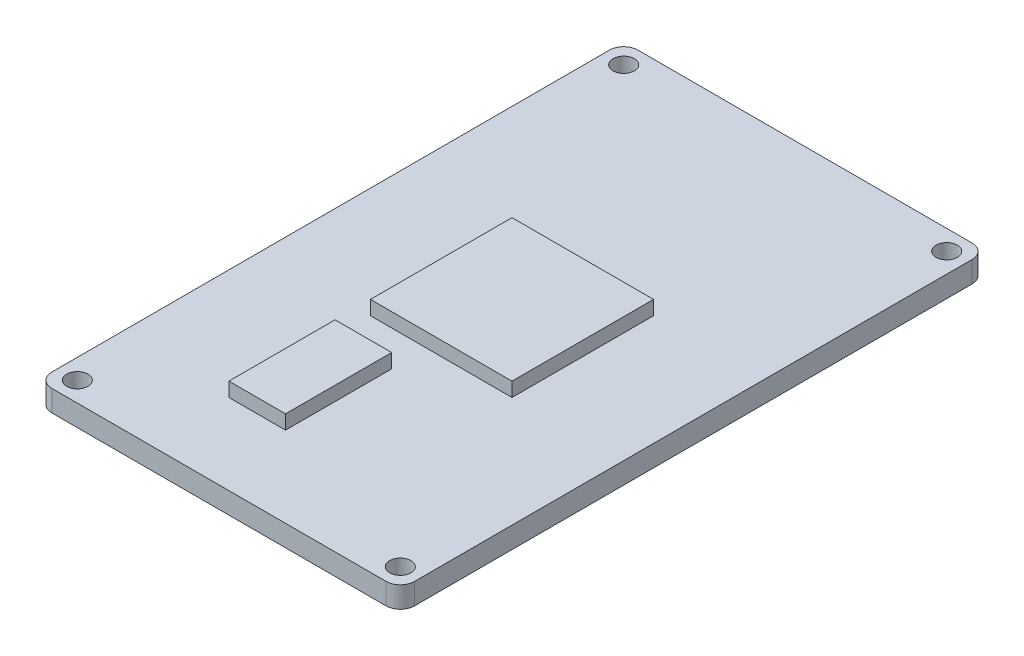
ISO-10303-21;
HEADER;
FILE_DESCRIPTION(('STEP AP214'),'2;1');
FILE_NAME('part.step','',(''),(''),'','','');
FILE_SCHEMA(('AUTOMOTIVE_DESIGN { 1 0 10303 214 1 1 1 1 }'));
ENDSEC;
DATA;
#1=APPLICATION_CONTEXT('core data for automotive mechanical design processes');
#2=APPLICATION_PROTOCOL_DEFINITION('international standard','automotive_design',2000,#1);
#3=PRODUCT_CONTEXT('',#1,'mechanical');
#4=PRODUCT('Part','Part','',(#3));
#5=PRODUCT_RELATED_PRODUCT_CATEGORY('part','',(#4));
#6=PRODUCT_DEFINITION_FORMATION('','',#4);
#7=PRODUCT_DEFINITION_CONTEXT('part definition',#1,'design');
#8=PRODUCT_DEFINITION('design','',#6,#7);
#9=PRODUCT_DEFINITION_SHAPE('','',#8);
#10=(LENGTH_UNIT() NAMED_UNIT(*) SI_UNIT(.MILLI.,.METRE.));
#11=(NAMED_UNIT(*) PLANE_ANGLE_UNIT() SI_UNIT($,.RADIAN.));
#12=(NAMED_UNIT(*) SI_UNIT($,.STERADIAN.) SOLID_ANGLE_UNIT());
#13=UNCERTAINTY_MEASURE_WITH_UNIT(LENGTH_MEASURE(1.E-05),#10,'distance_accuracy_value','');
#14=(GEOMETRIC_REPRESENTATION_CONTEXT(3) GLOBAL_UNCERTAINTY_ASSIGNED_CONTEXT((#13)) GLOBAL_UNIT_ASSIGNED_CONTEXT((#10,
#11,#12)) REPRESENTATION_CONTEXT('',''));
#15=CARTESIAN_POINT('',(0.,0.,0.));
#16=DIRECTION('',(0.,0.,1.));
#17=DIRECTION('',(1.,0.,0.));
#18=AXIS2_PLACEMENT_3D('',#15,#16,#17);
#19=CARTESIAN_POINT('',(0.,3.,0.));
#20=DIRECTION('',(0.,1.,0.));
#21=DIRECTION('',(0.,0.,1.));
#22=AXIS2_PLACEMENT_3D('',#19,#20,#21);
#23=PLANE('',#22);
#24=CARTESIAN_POINT('',(22.82,3.,38.6));
#25=DIRECTION('',(0.,-1.,0.));
#26=DIRECTION('',(0.,0.,-1.));
#27=AXIS2_PLACEMENT_3D('',#24,#25,#26);
#28=CIRCLE('',#27,1.5);
#29=CARTESIAN_POINT('',(22.82,3.,37.1));
#30=VERTEX_POINT('',#29);
#31=EDGE_CURVE('E269',#30,#30,#28,.T.);
#32=ORIENTED_EDGE('',*,*,#31,.T.);
#33=EDGE_LOOP('',(#32));
#34=FACE_BOUND('',#33,.T.);
#35=CARTESIAN_POINT('',(22.82,3.,-38.6));
#36=DIRECTION('',(0.,1.,0.));
#37=DIRECTION('',(0.,0.,1.));
#38=AXIS2_PLACEMENT_3D('',#35,#36,#37);
#39=CIRCLE('',#38,1.5);
#40=CARTESIAN_POINT('',(22.82,3.,-37.1));
#41=VERTEX_POINT('',#40);
#42=EDGE_CURVE('E287',#41,#41,#39,.T.);
#43=ORIENTED_EDGE('',*,*,#42,.F.);
#44=EDGE_LOOP('',(#43));
#45=FACE_BOUND('',#44,.T.);
#46=DIRECTION('',(1.,0.,0.));
#47=VECTOR('',#46,1.);
#48=CARTESIAN_POINT('',(-25.62,3.,-41.4));
#49=LINE('',#48,#47);
#50=CARTESIAN_POINT('',(-23.62,3.,-41.4));
#51=VERTEX_POINT('',#50);
#52=CARTESIAN_POINT('',(23.62,3.,-41.4));
#53=VERTEX_POINT('',#52);
#54=EDGE_CURVE('E298',#51,#53,#49,.T.);
#55=ORIENTED_EDGE('',*,*,#54,.F.);
#56=CARTESIAN_POINT('',(-23.62,3.,-39.4));
#57=DIRECTION('',(0.,1.,0.));
#58=DIRECTION('',(0.,0.,1.));
#59=AXIS2_PLACEMENT_3D('',#56,#57,#58);
#60=CIRCLE('',#59,2.);
#61=CARTESIAN_POINT('',(-25.62,3.,-39.4));
#62=VERTEX_POINT('',#61);
#63=EDGE_CURVE('E336',#51,#62,#60,.T.);
#64=ORIENTED_EDGE('',*,*,#63,.T.);
#65=DIRECTION('',(0.,0.,-1.));
#66=VECTOR('',#65,1.);
#67=CARTESIAN_POINT('',(-25.62,3.,41.4));
#68=LINE('',#67,#66);
#69=CARTESIAN_POINT('',(-25.62,3.,39.4));
#70=VERTEX_POINT('',#69);
#71=EDGE_CURVE('E301',#70,#62,#68,.T.);
#72=ORIENTED_EDGE('',*,*,#71,.F.);
#73=CARTESIAN_POINT('',(-23.62,3.,39.4));
#74=DIRECTION('',(0.,1.,0.));
#75=DIRECTION('',(0.,0.,1.));
#76=AXIS2_PLACEMENT_3D('',#73,#74,#75);
#77=CIRCLE('',#76,2.);
#78=CARTESIAN_POINT('',(-23.62,3.,41.4));
#79=VERTEX_POINT('',#78);
#80=EDGE_CURVE('E331',#70,#79,#77,.T.);
#81=ORIENTED_EDGE('',*,*,#80,.T.);
#82=DIRECTION('',(1.,0.,0.));
#83=VECTOR('',#82,1.);
#84=CARTESIAN_POINT('',(-25.62,3.,41.4));
#85=LINE('',#84,#83);
#86=CARTESIAN_POINT('',(23.62,3.,41.4));
#87=VERTEX_POINT('',#86);
#88=EDGE_CURVE('E293',#79,#87,#85,.T.);
#89=ORIENTED_EDGE('',*,*,#88,.T.);
#90=CARTESIAN_POINT('',(23.62,3.,39.4));
#91=DIRECTION('',(0.,1.,0.));
#92=DIRECTION('',(0.,0.,1.));
#93=AXIS2_PLACEMENT_3D('',#90,#91,#92);
#94=CIRCLE('',#93,2.);
#95=CARTESIAN_POINT('',(25.62,3.,39.4));
#96=VERTEX_POINT('',#95);
#97=EDGE_CURVE('E117',#87,#96,#94,.T.);
#98=ORIENTED_EDGE('',*,*,#97,.T.);
#99=DIRECTION('',(0.,0.,-1.));
#100=VECTOR('',#99,1.);
#101=CARTESIAN_POINT('',(25.62,3.,41.4));
#102=LINE('',#101,#100);
#103=CARTESIAN_POINT('',(25.62,3.,-39.4));
#104=VERTEX_POINT('',#103);
#105=EDGE_CURVE('E295',#96,#104,#102,.T.);
#106=ORIENTED_EDGE('',*,*,#105,.T.);
#107=CARTESIAN_POINT('',(23.62,3.,-39.4));
#108=DIRECTION('',(0.,1.,0.));
#109=DIRECTION('',(0.,0.,1.));
#110=AXIS2_PLACEMENT_3D('',#107,#108,#109);
#111=CIRCLE('',#110,2.);
#112=EDGE_CURVE('E334',#104,#53,#111,.T.);
#113=ORIENTED_EDGE('',*,*,#112,.T.);
#114=EDGE_LOOP('',(#55,#64,#72,#81,#89,#98,#106,#113));
#115=FACE_BOUND('',#114,.T.);
#116=CARTESIAN_POINT('',(-22.82,3.,-38.6));
#117=DIRECTION('',(0.,-1.,0.));
#118=DIRECTION('',(0.,0.,-1.));
#119=AXIS2_PLACEMENT_3D('',#116,#117,#118);
#120=CIRCLE('',#119,1.5);
#121=CARTESIAN_POINT('',(-22.82,3.,-40.1));
#122=VERTEX_POINT('',#121);
#123=EDGE_CURVE('E281',#122,#122,#120,.T.);
#124=ORIENTED_EDGE('',*,*,#123,.T.);
#125=EDGE_LOOP('',(#124));
#126=FACE_BOUND('',#125,.T.);
#127=CARTESIAN_POINT('',(-22.82,3.,38.6));
#128=DIRECTION('',(0.,1.,0.));
#129=DIRECTION('',(0.,0.,1.));
#130=AXIS2_PLACEMENT_3D('',#127,#128,#129);
#131=CIRCLE('',#130,1.5);
#132=CARTESIAN_POINT('',(-22.82,3.,40.1));
#133=VERTEX_POINT('',#132);
#134=EDGE_CURVE('E275',#133,#133,#131,.T.);
#135=ORIENTED_EDGE('',*,*,#134,.F.);
#136=EDGE_LOOP('',(#135));
#137=FACE_BOUND('',#136,.T.);
#138=DIRECTION('',(-1.,0.,0.));
#139=VECTOR('',#138,1.);
#140=CARTESIAN_POINT('',(-10.,3.,-10.));
#141=LINE('',#140,#139);
#142=CARTESIAN_POINT('',(10.,3.,-10.));
#143=VERTEX_POINT('',#142);
#144=CARTESIAN_POINT('',(-10.,3.,-10.));
#145=VERTEX_POINT('',#144);
#146=EDGE_CURVE('E237',#143,#145,#141,.T.);
#147=ORIENTED_EDGE('',*,*,#146,.F.);
#148=DIRECTION('',(0.,0.,-1.));
#149=VECTOR('',#148,1.);
#150=CARTESIAN_POINT('',(10.,3.,-10.));
#151=LINE('',#150,#149);
#152=CARTESIAN_POINT('',(10.,3.,10.));
#153=VERTEX_POINT('',#152);
#154=EDGE_CURVE('E234',#153,#143,#151,.T.);
#155=ORIENTED_EDGE('',*,*,#154,.F.);
#156=DIRECTION('',(1.,0.,0.));
#157=VECTOR('',#156,1.);
#158=CARTESIAN_POINT('',(-10.,3.,10.));
#159=LINE('',#158,#157);
#160=CARTESIAN_POINT('',(-10.,3.,10.));
#161=VERTEX_POINT('',#160);
#162=EDGE_CURVE('E247',#161,#153,#159,.T.);
#163=ORIENTED_EDGE('',*,*,#162,.F.);
#164=DIRECTION('',(0.,0.,1.));
#165=VECTOR('',#164,1.);
#166=CARTESIAN_POINT('',(-10.,3.,-10.));
#167=LINE('',#166,#165);
#168=EDGE_CURVE('E255',#145,#161,#167,.T.);
#169=ORIENTED_EDGE('',*,*,#168,.F.);
#170=EDGE_LOOP('',(#147,#155,#163,#169));
#171=FACE_BOUND('',#170,.T.);
#172=DIRECTION('',(1.,0.,0.));
#173=VECTOR('',#172,1.);
#174=CARTESIAN_POINT('',(-2.,3.,30.));
#175=LINE('',#174,#173);
#176=CARTESIAN_POINT('',(-10.,3.,30.));
#177=VERTEX_POINT('',#176);
#178=CARTESIAN_POINT('',(-2.,3.,30.));
#179=VERTEX_POINT('',#178);
#180=EDGE_CURVE('E610',#177,#179,#175,.T.);
#181=ORIENTED_EDGE('',*,*,#180,.F.);
#182=DIRECTION('',(0.,0.,1.));
#183=VECTOR('',#182,1.);
#184=CARTESIAN_POINT('',(-10.,3.,15.));
#185=LINE('',#184,#183);
#186=CARTESIAN_POINT('',(-10.,3.,15.));
#187=VERTEX_POINT('',#186);
#188=EDGE_CURVE('E232',#187,#177,#185,.T.);
#189=ORIENTED_EDGE('',*,*,#188,.F.);
#190=DIRECTION('',(-1.,0.,0.));
#191=VECTOR('',#190,1.);
#192=CARTESIAN_POINT('',(-2.,3.,15.));
#193=LINE('',#192,#191);
#194=CARTESIAN_POINT('',(-2.,3.,15.));
#195=VERTEX_POINT('',#194);
#196=EDGE_CURVE('E228',#195,#187,#193,.T.);
#197=ORIENTED_EDGE('',*,*,#196,.F.);
#198=DIRECTION('',(0.,0.,-1.));
#199=VECTOR('',#198,1.);
#200=CARTESIAN_POINT('',(-2.,3.,15.));
#201=LINE('',#200,#199);
#202=EDGE_CURVE('E613',#179,#195,#201,.T.);
#203=ORIENTED_EDGE('',*,*,#202,.F.);
#204=EDGE_LOOP('',(#181,#189,#197,#203));
#205=FACE_BOUND('',#204,.T.);
#206=ADVANCED_FACE('F95',(#34,#45,#115,#126,#137,#171,#205),#23,.T.);
#207=CARTESIAN_POINT('',(0.,0.,0.));
#208=DIRECTION('',(0.,1.,0.));
#209=DIRECTION('',(0.,0.,1.));
#210=AXIS2_PLACEMENT_3D('',#207,#208,#209);
#211=PLANE('',#210);
#212=CARTESIAN_POINT('',(22.82,0.,38.6));
#213=DIRECTION('',(0.,-1.,0.));
#214=DIRECTION('',(0.,0.,-1.));
#215=AXIS2_PLACEMENT_3D('',#212,#213,#214);
#216=CIRCLE('',#215,1.5);
#217=CARTESIAN_POINT('',(22.82,0.,37.1));
#218=VERTEX_POINT('',#217);
#219=EDGE_CURVE('E268',#218,#218,#216,.T.);
#220=ORIENTED_EDGE('',*,*,#219,.F.);
#221=EDGE_LOOP('',(#220));
#222=FACE_BOUND('',#221,.T.);
#223=CARTESIAN_POINT('',(-22.82,0.,-38.6));
#224=DIRECTION('',(0.,-1.,0.));
#225=DIRECTION('',(0.,0.,-1.));
#226=AXIS2_PLACEMENT_3D('',#223,#224,#225);
#227=CIRCLE('',#226,1.5);
#228=CARTESIAN_POINT('',(-22.82,0.,-40.1));
#229=VERTEX_POINT('',#228);
#230=EDGE_CURVE('E278',#229,#229,#227,.T.);
#231=ORIENTED_EDGE('',*,*,#230,.F.);
#232=EDGE_LOOP('',(#231));
#233=FACE_BOUND('',#232,.T.);
#234=DIRECTION('',(0.,0.,-1.));
#235=VECTOR('',#234,1.);
#236=CARTESIAN_POINT('',(-25.62,0.,41.4));
#237=LINE('',#236,#235);
#238=CARTESIAN_POINT('',(-25.62,0.,39.4));
#239=VERTEX_POINT('',#238);
#240=CARTESIAN_POINT('',(-25.62,0.,-39.4));
#241=VERTEX_POINT('',#240);
#242=EDGE_CURVE('E296',#239,#241,#237,.T.);
#243=ORIENTED_EDGE('',*,*,#242,.T.);
#244=CARTESIAN_POINT('',(-23.62,0.,-39.4));
#245=DIRECTION('',(0.,1.,0.));
#246=DIRECTION('',(0.,0.,1.));
#247=AXIS2_PLACEMENT_3D('',#244,#245,#246);
#248=CIRCLE('',#247,2.);
#249=CARTESIAN_POINT('',(-23.62,0.,-41.4));
#250=VERTEX_POINT('',#249);
#251=EDGE_CURVE('E324',#241,#250,#248,.F.);
#252=ORIENTED_EDGE('',*,*,#251,.T.);
#253=DIRECTION('',(1.,0.,0.));
#254=VECTOR('',#253,1.);
#255=CARTESIAN_POINT('',(-25.62,0.,-41.4));
#256=LINE('',#255,#254);
#257=CARTESIAN_POINT('',(23.62,0.,-41.4));
#258=VERTEX_POINT('',#257);
#259=EDGE_CURVE('E309',#250,#258,#256,.T.);
#260=ORIENTED_EDGE('',*,*,#259,.T.);
#261=CARTESIAN_POINT('',(23.62,0.,-39.4));
#262=DIRECTION('',(0.,1.,0.));
#263=DIRECTION('',(0.,0.,1.));
#264=AXIS2_PLACEMENT_3D('',#261,#262,#263);
#265=CIRCLE('',#264,2.);
#266=CARTESIAN_POINT('',(25.62,0.,-39.4));
#267=VERTEX_POINT('',#266);
#268=EDGE_CURVE('E322',#258,#267,#265,.F.);
#269=ORIENTED_EDGE('',*,*,#268,.T.);
#270=DIRECTION('',(0.,0.,-1.));
#271=VECTOR('',#270,1.);
#272=CARTESIAN_POINT('',(25.62,0.,41.4));
#273=LINE('',#272,#271);
#274=CARTESIAN_POINT('',(25.62,0.,39.4));
#275=VERTEX_POINT('',#274);
#276=EDGE_CURVE('E307',#275,#267,#273,.T.);
#277=ORIENTED_EDGE('',*,*,#276,.F.);
#278=CARTESIAN_POINT('',(23.62,0.,39.4));
#279=DIRECTION('',(0.,1.,0.));
#280=DIRECTION('',(0.,0.,1.));
#281=AXIS2_PLACEMENT_3D('',#278,#279,#280);
#282=CIRCLE('',#281,2.);
#283=CARTESIAN_POINT('',(23.62,0.,41.4));
#284=VERTEX_POINT('',#283);
#285=EDGE_CURVE('E320',#275,#284,#282,.F.);
#286=ORIENTED_EDGE('',*,*,#285,.T.);
#287=DIRECTION('',(1.,0.,0.));
#288=VECTOR('',#287,1.);
#289=CARTESIAN_POINT('',(-25.62,0.,41.4));
#290=LINE('',#289,#288);
#291=CARTESIAN_POINT('',(-23.62,0.,41.4));
#292=VERTEX_POINT('',#291);
#293=EDGE_CURVE('E290',#292,#284,#290,.T.);
#294=ORIENTED_EDGE('',*,*,#293,.F.);
#295=CARTESIAN_POINT('',(-23.62,0.,39.4));
#296=DIRECTION('',(0.,1.,0.));
#297=DIRECTION('',(0.,0.,1.));
#298=AXIS2_PLACEMENT_3D('',#295,#296,#297);
#299=CIRCLE('',#298,2.);
#300=EDGE_CURVE('E318',#292,#239,#299,.F.);
#301=ORIENTED_EDGE('',*,*,#300,.T.);
#302=EDGE_LOOP('',(#243,#252,#260,#269,#277,#286,#294,#301));
#303=FACE_BOUND('',#302,.T.);
#304=CARTESIAN_POINT('',(22.82,0.,-38.6));
#305=DIRECTION('',(0.,1.,0.));
#306=DIRECTION('',(0.,0.,1.));
#307=AXIS2_PLACEMENT_3D('',#304,#305,#306);
#308=CIRCLE('',#307,1.5);
#309=CARTESIAN_POINT('',(22.82,0.,-37.1));
#310=VERTEX_POINT('',#309);
#311=EDGE_CURVE('E284',#310,#310,#308,.T.);
#312=ORIENTED_EDGE('',*,*,#311,.T.);
#313=EDGE_LOOP('',(#312));
#314=FACE_BOUND('',#313,.T.);
#315=CARTESIAN_POINT('',(-22.82,0.,38.6));
#316=DIRECTION('',(0.,1.,0.));
#317=DIRECTION('',(0.,0.,1.));
#318=AXIS2_PLACEMENT_3D('',#315,#316,#317);
#319=CIRCLE('',#318,1.5);
#320=CARTESIAN_POINT('',(-22.82,0.,40.1));
#321=VERTEX_POINT('',#320);
#322=EDGE_CURVE('E272',#321,#321,#319,.T.);
#323=ORIENTED_EDGE('',*,*,#322,.T.);
#324=EDGE_LOOP('',(#323));
#325=FACE_BOUND('',#324,.T.);
#326=ADVANCED_FACE('F351',(#222,#233,#303,#314,#325),#211,.F.);
#327=CARTESIAN_POINT('',(-25.62,3.,41.4));
#328=DIRECTION('',(0.,0.,-1.));
#329=DIRECTION('',(-1.,0.,0.));
#330=AXIS2_PLACEMENT_3D('',#327,#328,#329);
#331=PLANE('',#330);
#332=ORIENTED_EDGE('',*,*,#293,.T.);
#333=DIRECTION('',(0.,-1.,0.));
#334=VECTOR('',#333,1.);
#335=CARTESIAN_POINT('',(23.62,3.,41.4));
#336=LINE('',#335,#334);
#337=EDGE_CURVE('E12',#284,#87,#336,.F.);
#338=ORIENTED_EDGE('',*,*,#337,.T.);
#339=ORIENTED_EDGE('',*,*,#88,.F.);
#340=DIRECTION('',(0.,-1.,0.));
#341=VECTOR('',#340,1.);
#342=CARTESIAN_POINT('',(-23.62,0.,41.4));
#343=LINE('',#342,#341);
#344=EDGE_CURVE('E103',#79,#292,#343,.T.);
#345=ORIENTED_EDGE('',*,*,#344,.T.);
#346=EDGE_LOOP('',(#332,#338,#339,#345));
#347=FACE_BOUND('',#346,.T.);
#348=ADVANCED_FACE('F346',(#347),#331,.F.);
#349=CARTESIAN_POINT('',(25.62,3.,41.4));
#350=DIRECTION('',(-1.,0.,0.));
#351=DIRECTION('',(0.,0.,1.));
#352=AXIS2_PLACEMENT_3D('',#349,#350,#351);
#353=PLANE('',#352);
#354=ORIENTED_EDGE('',*,*,#276,.T.);
#355=DIRECTION('',(0.,-1.,0.));
#356=VECTOR('',#355,1.);
#357=CARTESIAN_POINT('',(25.62,3.,-39.4));
#358=LINE('',#357,#356);
#359=EDGE_CURVE('E110',#267,#104,#358,.F.);
#360=ORIENTED_EDGE('',*,*,#359,.T.);
#361=ORIENTED_EDGE('',*,*,#105,.F.);
#362=DIRECTION('',(0.,-1.,0.));
#363=VECTOR('',#362,1.);
#364=CARTESIAN_POINT('',(25.62,3.,39.4));
#365=LINE('',#364,#363);
#366=EDGE_CURVE('E338',#96,#275,#365,.T.);
#367=ORIENTED_EDGE('',*,*,#366,.T.);
#368=EDGE_LOOP('',(#354,#360,#361,#367));
#369=FACE_BOUND('',#368,.T.);
#370=ADVANCED_FACE('F358',(#369),#353,.F.);
#371=CARTESIAN_POINT('',(-25.62,3.,-41.4));
#372=DIRECTION('',(0.,0.,-1.));
#373=DIRECTION('',(-1.,0.,0.));
#374=AXIS2_PLACEMENT_3D('',#371,#372,#373);
#375=PLANE('',#374);
#376=ORIENTED_EDGE('',*,*,#259,.F.);
#377=DIRECTION('',(0.,-1.,0.));
#378=VECTOR('',#377,1.);
#379=CARTESIAN_POINT('',(-23.62,3.,-41.4));
#380=LINE('',#379,#378);
#381=EDGE_CURVE('E329',#250,#51,#380,.F.);
#382=ORIENTED_EDGE('',*,*,#381,.T.);
#383=ORIENTED_EDGE('',*,*,#54,.T.);
#384=DIRECTION('',(0.,-1.,0.));
#385=VECTOR('',#384,1.);
#386=CARTESIAN_POINT('',(23.62,0.,-41.4));
#387=LINE('',#386,#385);
#388=EDGE_CURVE('E326',#53,#258,#387,.T.);
#389=ORIENTED_EDGE('',*,*,#388,.T.);
#390=EDGE_LOOP('',(#376,#382,#383,#389));
#391=FACE_BOUND('',#390,.T.);
#392=ADVANCED_FACE('F367',(#391),#375,.T.);
#393=CARTESIAN_POINT('',(-25.62,3.,41.4));
#394=DIRECTION('',(-1.,0.,0.));
#395=DIRECTION('',(0.,0.,1.));
#396=AXIS2_PLACEMENT_3D('',#393,#394,#395);
#397=PLANE('',#396);
#398=ORIENTED_EDGE('',*,*,#71,.T.);
#399=DIRECTION('',(0.,-1.,0.));
#400=VECTOR('',#399,1.);
#401=CARTESIAN_POINT('',(-25.62,3.,-39.4));
#402=LINE('',#401,#400);
#403=EDGE_CURVE('E315',#62,#241,#402,.T.);
#404=ORIENTED_EDGE('',*,*,#403,.T.);
#405=ORIENTED_EDGE('',*,*,#242,.F.);
#406=DIRECTION('',(0.,-1.,0.));
#407=VECTOR('',#406,1.);
#408=CARTESIAN_POINT('',(-25.62,3.,39.4));
#409=LINE('',#408,#407);
#410=EDGE_CURVE('E304',#239,#70,#409,.F.);
#411=ORIENTED_EDGE('',*,*,#410,.T.);
#412=EDGE_LOOP('',(#398,#404,#405,#411));
#413=FACE_BOUND('',#412,.T.);
#414=ADVANCED_FACE('F374',(#413),#397,.T.);
#415=CARTESIAN_POINT('',(22.82,3.,-38.6));
#416=DIRECTION('',(0.,-1.,0.));
#417=DIRECTION('',(0.,0.,-1.));
#418=AXIS2_PLACEMENT_3D('',#415,#416,#417);
#419=CYLINDRICAL_SURFACE('',#418,1.5);
#420=ORIENTED_EDGE('',*,*,#42,.T.);
#421=EDGE_LOOP('',(#420));
#422=FACE_BOUND('',#421,.T.);
#423=ORIENTED_EDGE('',*,*,#311,.F.);
#424=EDGE_LOOP('',(#423));
#425=FACE_BOUND('',#424,.T.);
#426=ADVANCED_FACE('F391',(#422,#425),#419,.F.);
#427=CARTESIAN_POINT('',(-22.82,3.,-38.6));
#428=DIRECTION('',(0.,-1.,0.));
#429=DIRECTION('',(0.,0.,-1.));
#430=AXIS2_PLACEMENT_3D('',#427,#428,#429);
#431=CYLINDRICAL_SURFACE('',#430,1.5);
#432=ORIENTED_EDGE('',*,*,#123,.F.);
#433=EDGE_LOOP('',(#432));
#434=FACE_BOUND('',#433,.T.);
#435=ORIENTED_EDGE('',*,*,#230,.T.);
#436=EDGE_LOOP('',(#435));
#437=FACE_BOUND('',#436,.T.);
#438=ADVANCED_FACE('F533',(#434,#437),#431,.F.);
#439=CARTESIAN_POINT('',(-22.82,3.,38.6));
#440=DIRECTION('',(0.,-1.,0.));
#441=DIRECTION('',(0.,0.,-1.));
#442=AXIS2_PLACEMENT_3D('',#439,#440,#441);
#443=CYLINDRICAL_SURFACE('',#442,1.5);
#444=ORIENTED_EDGE('',*,*,#134,.T.);
#445=EDGE_LOOP('',(#444));
#446=FACE_BOUND('',#445,.T.);
#447=ORIENTED_EDGE('',*,*,#322,.F.);
#448=EDGE_LOOP('',(#447));
#449=FACE_BOUND('',#448,.T.);
#450=ADVANCED_FACE('F524',(#446,#449),#443,.F.);
#451=CARTESIAN_POINT('',(22.82,3.,38.6));
#452=DIRECTION('',(0.,-1.,0.));
#453=DIRECTION('',(0.,0.,-1.));
#454=AXIS2_PLACEMENT_3D('',#451,#452,#453);
#455=CYLINDRICAL_SURFACE('',#454,1.5);
#456=ORIENTED_EDGE('',*,*,#31,.F.);
#457=EDGE_LOOP('',(#456));
#458=FACE_BOUND('',#457,.T.);
#459=ORIENTED_EDGE('',*,*,#219,.T.);
#460=EDGE_LOOP('',(#459));
#461=FACE_BOUND('',#460,.T.);
#462=ADVANCED_FACE('F510',(#458,#461),#455,.F.);
#463=CARTESIAN_POINT('',(10.,5.,-10.));
#464=DIRECTION('',(-1.,0.,0.));
#465=DIRECTION('',(0.,0.,1.));
#466=AXIS2_PLACEMENT_3D('',#463,#464,#465);
#467=PLANE('',#466);
#468=ORIENTED_EDGE('',*,*,#154,.T.);
#469=DIRECTION('',(0.,-1.,0.));
#470=VECTOR('',#469,1.);
#471=CARTESIAN_POINT('',(10.,5.,-10.));
#472=LINE('',#471,#470);
#473=CARTESIAN_POINT('',(10.,5.,-10.));
#474=VERTEX_POINT('',#473);
#475=EDGE_CURVE('E266',#474,#143,#472,.T.);
#476=ORIENTED_EDGE('',*,*,#475,.F.);
#477=DIRECTION('',(0.,0.,-1.));
#478=VECTOR('',#477,1.);
#479=CARTESIAN_POINT('',(10.,5.,-10.));
#480=LINE('',#479,#478);
#481=CARTESIAN_POINT('',(10.,5.,10.));
#482=VERTEX_POINT('',#481);
#483=EDGE_CURVE('E243',#482,#474,#480,.T.);
#484=ORIENTED_EDGE('',*,*,#483,.F.);
#485=DIRECTION('',(0.,-1.,0.));
#486=VECTOR('',#485,1.);
#487=CARTESIAN_POINT('',(10.,5.,10.));
#488=LINE('',#487,#486);
#489=EDGE_CURVE('E252',#482,#153,#488,.T.);
#490=ORIENTED_EDGE('',*,*,#489,.T.);
#491=EDGE_LOOP('',(#468,#476,#484,#490));
#492=FACE_BOUND('',#491,.T.);
#493=ADVANCED_FACE('F501',(#492),#467,.F.);
#494=CARTESIAN_POINT('',(-10.,5.,-10.));
#495=DIRECTION('',(0.,0.,1.));
#496=DIRECTION('',(1.,0.,0.));
#497=AXIS2_PLACEMENT_3D('',#494,#495,#496);
#498=PLANE('',#497);
#499=ORIENTED_EDGE('',*,*,#146,.T.);
#500=DIRECTION('',(0.,-1.,0.));
#501=VECTOR('',#500,1.);
#502=CARTESIAN_POINT('',(-10.,5.,-10.));
#503=LINE('',#502,#501);
#504=CARTESIAN_POINT('',(-10.,5.,-10.));
#505=VERTEX_POINT('',#504);
#506=EDGE_CURVE('E263',#505,#145,#503,.T.);
#507=ORIENTED_EDGE('',*,*,#506,.F.);
#508=DIRECTION('',(-1.,0.,0.));
#509=VECTOR('',#508,1.);
#510=CARTESIAN_POINT('',(-10.,5.,-10.));
#511=LINE('',#510,#509);
#512=EDGE_CURVE('E246',#474,#505,#511,.T.);
#513=ORIENTED_EDGE('',*,*,#512,.F.);
#514=ORIENTED_EDGE('',*,*,#475,.T.);
#515=EDGE_LOOP('',(#499,#507,#513,#514));
#516=FACE_BOUND('',#515,.T.);
#517=ADVANCED_FACE('F492',(#516),#498,.F.);
#518=CARTESIAN_POINT('',(-10.,5.,-10.));
#519=DIRECTION('',(1.,0.,0.));
#520=DIRECTION('',(0.,0.,-1.));
#521=AXIS2_PLACEMENT_3D('',#518,#519,#520);
#522=PLANE('',#521);
#523=ORIENTED_EDGE('',*,*,#168,.T.);
#524=DIRECTION('',(0.,-1.,0.));
#525=VECTOR('',#524,1.);
#526=CARTESIAN_POINT('',(-10.,5.,10.));
#527=LINE('',#526,#525);
#528=CARTESIAN_POINT('',(-10.,5.,10.));
#529=VERTEX_POINT('',#528);
#530=EDGE_CURVE('E261',#529,#161,#527,.T.);
#531=ORIENTED_EDGE('',*,*,#530,.F.);
#532=DIRECTION('',(0.,0.,1.));
#533=VECTOR('',#532,1.);
#534=CARTESIAN_POINT('',(-10.,5.,-10.));
#535=LINE('',#534,#533);
#536=EDGE_CURVE('E249',#505,#529,#535,.T.);
#537=ORIENTED_EDGE('',*,*,#536,.F.);
#538=ORIENTED_EDGE('',*,*,#506,.T.);
#539=EDGE_LOOP('',(#523,#531,#537,#538));
#540=FACE_BOUND('',#539,.T.);
#541=ADVANCED_FACE('F483',(#540),#522,.F.);
#542=CARTESIAN_POINT('',(-10.,5.,10.));
#543=DIRECTION('',(0.,0.,-1.));
#544=DIRECTION('',(-1.,0.,0.));
#545=AXIS2_PLACEMENT_3D('',#542,#543,#544);
#546=PLANE('',#545);
#547=ORIENTED_EDGE('',*,*,#162,.T.);
#548=ORIENTED_EDGE('',*,*,#489,.F.);
#549=DIRECTION('',(1.,0.,0.));
#550=VECTOR('',#549,1.);
#551=CARTESIAN_POINT('',(-10.,5.,10.));
#552=LINE('',#551,#550);
#553=EDGE_CURVE('E251',#529,#482,#552,.T.);
#554=ORIENTED_EDGE('',*,*,#553,.F.);
#555=ORIENTED_EDGE('',*,*,#530,.T.);
#556=EDGE_LOOP('',(#547,#548,#554,#555));
#557=FACE_BOUND('',#556,.T.);
#558=ADVANCED_FACE('F474',(#557),#546,.F.);
#559=CARTESIAN_POINT('',(0.,5.,0.));
#560=DIRECTION('',(0.,1.,0.));
#561=DIRECTION('',(0.,0.,1.));
#562=AXIS2_PLACEMENT_3D('',#559,#560,#561);
#563=PLANE('',#562);
#564=ORIENTED_EDGE('',*,*,#483,.T.);
#565=ORIENTED_EDGE('',*,*,#512,.T.);
#566=ORIENTED_EDGE('',*,*,#536,.T.);
#567=ORIENTED_EDGE('',*,*,#553,.T.);
#568=EDGE_LOOP('',(#564,#565,#566,#567));
#569=FACE_BOUND('',#568,.T.);
#570=ADVANCED_FACE('F466',(#569),#563,.T.);
#571=CARTESIAN_POINT('',(-10.,5.,15.));
#572=DIRECTION('',(1.,0.,0.));
#573=DIRECTION('',(0.,0.,-1.));
#574=AXIS2_PLACEMENT_3D('',#571,#572,#573);
#575=PLANE('',#574);
#576=ORIENTED_EDGE('',*,*,#188,.T.);
#577=DIRECTION('',(0.,-1.,0.));
#578=VECTOR('',#577,1.);
#579=CARTESIAN_POINT('',(-10.,5.,30.));
#580=LINE('',#579,#578);
#581=CARTESIAN_POINT('',(-10.,5.,30.));
#582=VERTEX_POINT('',#581);
#583=EDGE_CURVE('E212',#582,#177,#580,.T.);
#584=ORIENTED_EDGE('',*,*,#583,.F.);
#585=DIRECTION('',(0.,0.,1.));
#586=VECTOR('',#585,1.);
#587=CARTESIAN_POINT('',(-10.,5.,15.));
#588=LINE('',#587,#586);
#589=CARTESIAN_POINT('',(-10.,5.,15.));
#590=VERTEX_POINT('',#589);
#591=EDGE_CURVE('E219',#590,#582,#588,.T.);
#592=ORIENTED_EDGE('',*,*,#591,.F.);
#593=DIRECTION('',(0.,-1.,0.));
#594=VECTOR('',#593,1.);
#595=CARTESIAN_POINT('',(-10.,5.,15.));
#596=LINE('',#595,#594);
#597=EDGE_CURVE('E620',#590,#187,#596,.T.);
#598=ORIENTED_EDGE('',*,*,#597,.T.);
#599=EDGE_LOOP('',(#576,#584,#592,#598));
#600=FACE_BOUND('',#599,.T.);
#601=ADVANCED_FACE('F230',(#600),#575,.F.);
#602=CARTESIAN_POINT('',(-2.,5.,30.));
#603=DIRECTION('',(0.,0.,-1.));
#604=DIRECTION('',(-1.,0.,0.));
#605=AXIS2_PLACEMENT_3D('',#602,#603,#604);
#606=PLANE('',#605);
#607=ORIENTED_EDGE('',*,*,#180,.T.);
#608=DIRECTION('',(0.,-1.,0.));
#609=VECTOR('',#608,1.);
#610=CARTESIAN_POINT('',(-2.,5.,30.));
#611=LINE('',#610,#609);
#612=CARTESIAN_POINT('',(-2.,5.,30.));
#613=VERTEX_POINT('',#612);
#614=EDGE_CURVE('E215',#613,#179,#611,.T.);
#615=ORIENTED_EDGE('',*,*,#614,.F.);
#616=DIRECTION('',(1.,0.,0.));
#617=VECTOR('',#616,1.);
#618=CARTESIAN_POINT('',(-2.,5.,30.));
#619=LINE('',#618,#617);
#620=EDGE_CURVE('E208',#582,#613,#619,.T.);
#621=ORIENTED_EDGE('',*,*,#620,.F.);
#622=ORIENTED_EDGE('',*,*,#583,.T.);
#623=EDGE_LOOP('',(#607,#615,#621,#622));
#624=FACE_BOUND('',#623,.T.);
#625=ADVANCED_FACE('F210',(#624),#606,.F.);
#626=CARTESIAN_POINT('',(-2.,5.,15.));
#627=DIRECTION('',(-1.,0.,0.));
#628=DIRECTION('',(0.,0.,1.));
#629=AXIS2_PLACEMENT_3D('',#626,#627,#628);
#630=PLANE('',#629);
#631=ORIENTED_EDGE('',*,*,#202,.T.);
#632=DIRECTION('',(0.,-1.,0.));
#633=VECTOR('',#632,1.);
#634=CARTESIAN_POINT('',(-2.,5.,15.));
#635=LINE('',#634,#633);
#636=CARTESIAN_POINT('',(-2.,5.,15.));
#637=VERTEX_POINT('',#636);
#638=EDGE_CURVE('E239',#637,#195,#635,.T.);
#639=ORIENTED_EDGE('',*,*,#638,.F.);
#640=DIRECTION('',(0.,0.,-1.));
#641=VECTOR('',#640,1.);
#642=CARTESIAN_POINT('',(-2.,5.,15.));
#643=LINE('',#642,#641);
#644=EDGE_CURVE('E218',#613,#637,#643,.T.);
#645=ORIENTED_EDGE('',*,*,#644,.F.);
#646=ORIENTED_EDGE('',*,*,#614,.T.);
#647=EDGE_LOOP('',(#631,#639,#645,#646));
#648=FACE_BOUND('',#647,.T.);
#649=ADVANCED_FACE('F442',(#648),#630,.F.);
#650=CARTESIAN_POINT('',(-2.,5.,15.));
#651=DIRECTION('',(0.,0.,1.));
#652=DIRECTION('',(1.,0.,0.));
#653=AXIS2_PLACEMENT_3D('',#650,#651,#652);
#654=PLANE('',#653);
#655=ORIENTED_EDGE('',*,*,#196,.T.);
#656=ORIENTED_EDGE('',*,*,#597,.F.);
#657=DIRECTION('',(-1.,0.,0.));
#658=VECTOR('',#657,1.);
#659=CARTESIAN_POINT('',(-2.,5.,15.));
#660=LINE('',#659,#658);
#661=EDGE_CURVE('E224',#637,#590,#660,.T.);
#662=ORIENTED_EDGE('',*,*,#661,.F.);
#663=ORIENTED_EDGE('',*,*,#638,.T.);
#664=EDGE_LOOP('',(#655,#656,#662,#663));
#665=FACE_BOUND('',#664,.T.);
#666=ADVANCED_FACE('F434',(#665),#654,.F.);
#667=CARTESIAN_POINT('',(0.,5.,0.));
#668=DIRECTION('',(0.,-1.,0.));
#669=DIRECTION('',(0.,0.,-1.));
#670=AXIS2_PLACEMENT_3D('',#667,#668,#669);
#671=PLANE('',#670);
#672=ORIENTED_EDGE('',*,*,#591,.T.);
#673=ORIENTED_EDGE('',*,*,#620,.T.);
#674=ORIENTED_EDGE('',*,*,#644,.T.);
#675=ORIENTED_EDGE('',*,*,#661,.T.);
#676=EDGE_LOOP('',(#672,#673,#674,#675));
#677=FACE_BOUND('',#676,.T.);
#678=ADVANCED_FACE('F222',(#677),#671,.F.);
#679=CARTESIAN_POINT('',(-23.62,3.,-39.4));
#680=DIRECTION('',(0.,-1.,0.));
#681=DIRECTION('',(0.,0.,-1.));
#682=AXIS2_PLACEMENT_3D('',#679,#680,#681);
#683=CYLINDRICAL_SURFACE('',#682,2.);
#684=ORIENTED_EDGE('',*,*,#63,.F.);
#685=ORIENTED_EDGE('',*,*,#381,.F.);
#686=ORIENTED_EDGE('',*,*,#251,.F.);
#687=ORIENTED_EDGE('',*,*,#403,.F.);
#688=EDGE_LOOP('',(#684,#685,#686,#687));
#689=FACE_BOUND('',#688,.T.);
#690=ADVANCED_FACE('F372',(#689),#683,.T.);
#691=CARTESIAN_POINT('',(23.62,3.,-39.4));
#692=DIRECTION('',(0.,1.,0.));
#693=DIRECTION('',(0.,0.,1.));
#694=AXIS2_PLACEMENT_3D('',#691,#692,#693);
#695=CYLINDRICAL_SURFACE('',#694,2.);
#696=ORIENTED_EDGE('',*,*,#112,.F.);
#697=ORIENTED_EDGE('',*,*,#359,.F.);
#698=ORIENTED_EDGE('',*,*,#268,.F.);
#699=ORIENTED_EDGE('',*,*,#388,.F.);
#700=EDGE_LOOP('',(#696,#697,#698,#699));
#701=FACE_BOUND('',#700,.T.);
#702=ADVANCED_FACE('F364',(#701),#695,.T.);
#703=CARTESIAN_POINT('',(23.62,3.,39.4));
#704=DIRECTION('',(0.,-1.,0.));
#705=DIRECTION('',(0.,0.,-1.));
#706=AXIS2_PLACEMENT_3D('',#703,#704,#705);
#707=CYLINDRICAL_SURFACE('',#706,2.);
#708=ORIENTED_EDGE('',*,*,#97,.F.);
#709=ORIENTED_EDGE('',*,*,#337,.F.);
#710=ORIENTED_EDGE('',*,*,#285,.F.);
#711=ORIENTED_EDGE('',*,*,#366,.F.);
#712=EDGE_LOOP('',(#708,#709,#710,#711));
#713=FACE_BOUND('',#712,.T.);
#714=ADVANCED_FACE('F357',(#713),#707,.T.);
#715=CARTESIAN_POINT('',(-23.62,3.,39.4));
#716=DIRECTION('',(0.,1.,0.));
#717=DIRECTION('',(0.,0.,1.));
#718=AXIS2_PLACEMENT_3D('',#715,#716,#717);
#719=CYLINDRICAL_SURFACE('',#718,2.);
#720=ORIENTED_EDGE('',*,*,#80,.F.);
#721=ORIENTED_EDGE('',*,*,#410,.F.);
#722=ORIENTED_EDGE('',*,*,#300,.F.);
#723=ORIENTED_EDGE('',*,*,#344,.F.);
#724=EDGE_LOOP('',(#720,#721,#722,#723));
#725=FACE_BOUND('',#724,.T.);
#726=ADVANCED_FACE('F97',(#725),#719,.T.);
#727=CLOSED_SHELL('',(#206,#326,#348,#370,#392,#414,#426,#438,#450,#462,#493,#517,#541,#558,
#570,#601,#625,#649,#666,#678,#690,#702,#714,#726));
#728=MANIFOLD_SOLID_BREP('B2',#727);
#729=ADVANCED_BREP_SHAPE_REPRESENTATION('',(#18,#728),#14);
#730=SHAPE_DEFINITION_REPRESENTATION(#9,#729);
ENDSEC;
END-ISO-10303-21;
